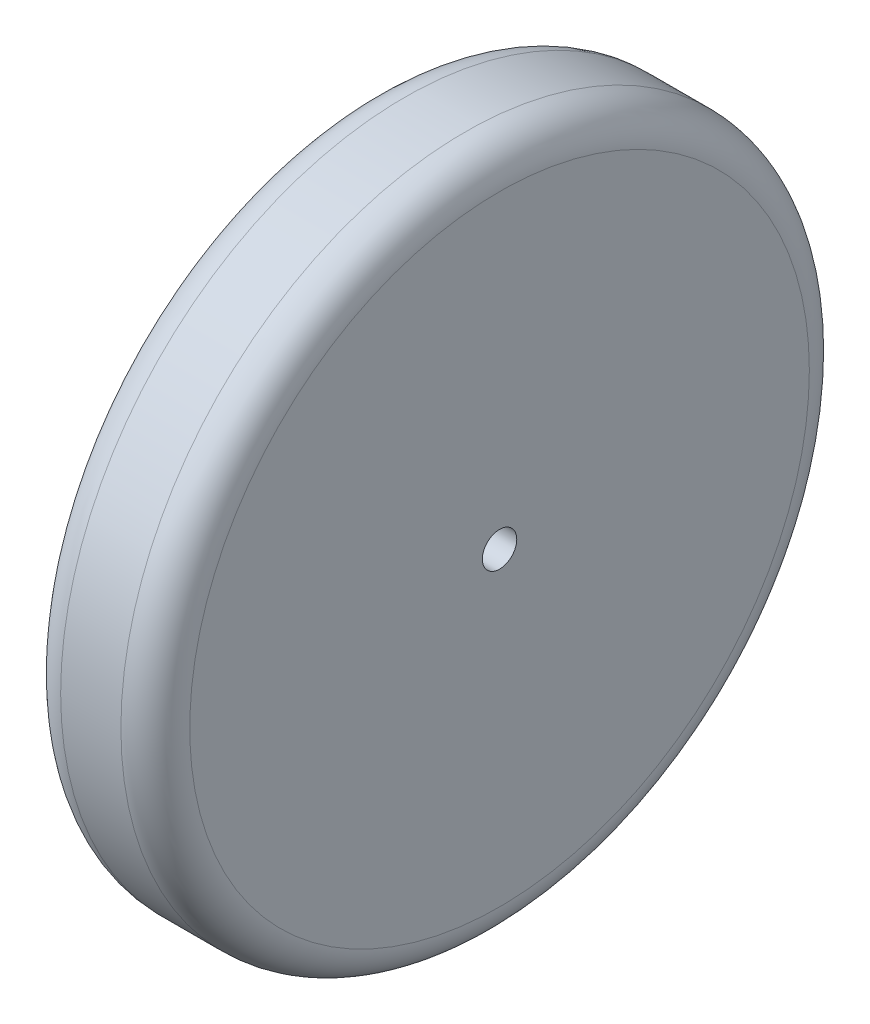
ISO-10303-21;
HEADER;
FILE_DESCRIPTION(('STEP AP214'),'2;1');
FILE_NAME('part.step','',(''),(''),'','','');
FILE_SCHEMA(('AUTOMOTIVE_DESIGN { 1 0 10303 214 1 1 1 1 }'));
ENDSEC;
DATA;
#1=APPLICATION_CONTEXT('core data for automotive mechanical design processes');
#2=APPLICATION_PROTOCOL_DEFINITION('international standard','automotive_design',2000,#1);
#3=PRODUCT_CONTEXT('',#1,'mechanical');
#4=PRODUCT('Part','Part','',(#3));
#5=PRODUCT_RELATED_PRODUCT_CATEGORY('part','',(#4));
#6=PRODUCT_DEFINITION_FORMATION('','',#4);
#7=PRODUCT_DEFINITION_CONTEXT('part definition',#1,'design');
#8=PRODUCT_DEFINITION('design','',#6,#7);
#9=PRODUCT_DEFINITION_SHAPE('','',#8);
#10=(LENGTH_UNIT() NAMED_UNIT(*) SI_UNIT(.MILLI.,.METRE.));
#11=(NAMED_UNIT(*) PLANE_ANGLE_UNIT() SI_UNIT($,.RADIAN.));
#12=(NAMED_UNIT(*) SI_UNIT($,.STERADIAN.) SOLID_ANGLE_UNIT());
#13=UNCERTAINTY_MEASURE_WITH_UNIT(LENGTH_MEASURE(1.E-05),#10,'distance_accuracy_value','');
#14=(GEOMETRIC_REPRESENTATION_CONTEXT(3) GLOBAL_UNCERTAINTY_ASSIGNED_CONTEXT((#13)) GLOBAL_UNIT_ASSIGNED_CONTEXT((#10,
#11,#12)) REPRESENTATION_CONTEXT('',''));
#15=CARTESIAN_POINT('',(0.,0.,0.));
#16=DIRECTION('',(0.,0.,1.));
#17=DIRECTION('',(1.,0.,0.));
#18=AXIS2_PLACEMENT_3D('',#15,#16,#17);
#19=CARTESIAN_POINT('',(37.5,0.,0.));
#20=DIRECTION('',(1.,0.,0.));
#21=DIRECTION('',(0.,0.,-1.));
#22=AXIS2_PLACEMENT_3D('',#19,#20,#21);
#23=PLANE('',#22);
#24=CARTESIAN_POINT('',(37.5,0.,0.));
#25=DIRECTION('',(1.,0.,0.));
#26=DIRECTION('',(0.,0.,-1.));
#27=AXIS2_PLACEMENT_3D('',#24,#25,#26);
#28=CIRCLE('',#27,180.);
#29=CARTESIAN_POINT('',(37.5,0.,-180.));
#30=VERTEX_POINT('',#29);
#31=EDGE_CURVE('E10',#30,#30,#28,.T.);
#32=ORIENTED_EDGE('',*,*,#31,.T.);
#33=EDGE_LOOP('',(#32));
#34=FACE_BOUND('',#33,.T.);
#35=CARTESIAN_POINT('',(37.5,0.,0.));
#36=DIRECTION('',(1.,0.,0.));
#37=DIRECTION('',(0.,0.,-1.));
#38=AXIS2_PLACEMENT_3D('',#35,#36,#37);
#39=CIRCLE('',#38,10.);
#40=CARTESIAN_POINT('',(37.5,0.,-10.));
#41=VERTEX_POINT('',#40);
#42=EDGE_CURVE('E67',#41,#41,#39,.T.);
#43=ORIENTED_EDGE('',*,*,#42,.F.);
#44=EDGE_LOOP('',(#43));
#45=FACE_BOUND('',#44,.T.);
#46=ADVANCED_FACE('F43',(#34,#45),#23,.T.);
#47=CARTESIAN_POINT('',(-37.5,0.,0.));
#48=DIRECTION('',(1.,0.,0.));
#49=DIRECTION('',(0.,0.,-1.));
#50=AXIS2_PLACEMENT_3D('',#47,#48,#49);
#51=PLANE('',#50);
#52=CARTESIAN_POINT('',(-37.5,0.,0.));
#53=DIRECTION('',(1.,0.,0.));
#54=DIRECTION('',(0.,0.,-1.));
#55=AXIS2_PLACEMENT_3D('',#52,#53,#54);
#56=CIRCLE('',#55,180.);
#57=CARTESIAN_POINT('',(-37.5,0.,-180.));
#58=VERTEX_POINT('',#57);
#59=EDGE_CURVE('E51',#58,#58,#56,.F.);
#60=ORIENTED_EDGE('',*,*,#59,.T.);
#61=EDGE_LOOP('',(#60));
#62=FACE_BOUND('',#61,.T.);
#63=CARTESIAN_POINT('',(-37.5,0.,0.));
#64=DIRECTION('',(1.,0.,0.));
#65=DIRECTION('',(0.,0.,-1.));
#66=AXIS2_PLACEMENT_3D('',#63,#64,#65);
#67=CIRCLE('',#66,10.);
#68=CARTESIAN_POINT('',(-37.5,0.,-10.));
#69=VERTEX_POINT('',#68);
#70=EDGE_CURVE('E68',#69,#69,#67,.T.);
#71=ORIENTED_EDGE('',*,*,#70,.T.);
#72=EDGE_LOOP('',(#71));
#73=FACE_BOUND('',#72,.T.);
#74=ADVANCED_FACE('F80',(#62,#73),#51,.F.);
#75=CARTESIAN_POINT('',(37.5,0.,0.));
#76=DIRECTION('',(-1.,0.,0.));
#77=DIRECTION('',(0.,0.,1.));
#78=AXIS2_PLACEMENT_3D('',#75,#76,#77);
#79=CYLINDRICAL_SURFACE('',#78,200.);
#80=CARTESIAN_POINT('',(-17.5,0.,0.));
#81=DIRECTION('',(1.,0.,0.));
#82=DIRECTION('',(0.,0.,-1.));
#83=AXIS2_PLACEMENT_3D('',#80,#81,#82);
#84=CIRCLE('',#83,200.);
#85=CARTESIAN_POINT('',(-17.5,0.,-200.));
#86=VERTEX_POINT('',#85);
#87=EDGE_CURVE('E56',#86,#86,#84,.T.);
#88=ORIENTED_EDGE('',*,*,#87,.T.);
#89=EDGE_LOOP('',(#88));
#90=FACE_BOUND('',#89,.T.);
#91=CARTESIAN_POINT('',(17.5,0.,0.));
#92=DIRECTION('',(1.,0.,0.));
#93=DIRECTION('',(0.,0.,-1.));
#94=AXIS2_PLACEMENT_3D('',#91,#92,#93);
#95=CIRCLE('',#94,200.);
#96=CARTESIAN_POINT('',(17.5,0.,-200.));
#97=VERTEX_POINT('',#96);
#98=EDGE_CURVE('E61',#97,#97,#95,.F.);
#99=ORIENTED_EDGE('',*,*,#98,.T.);
#100=EDGE_LOOP('',(#99));
#101=FACE_BOUND('',#100,.T.);
#102=ADVANCED_FACE('F86',(#90,#101),#79,.T.);
#103=CARTESIAN_POINT('',(37.5,0.,0.));
#104=DIRECTION('',(-1.,0.,0.));
#105=DIRECTION('',(0.,0.,1.));
#106=AXIS2_PLACEMENT_3D('',#103,#104,#105);
#107=CYLINDRICAL_SURFACE('',#106,10.);
#108=ORIENTED_EDGE('',*,*,#42,.T.);
#109=EDGE_LOOP('',(#108));
#110=FACE_BOUND('',#109,.T.);
#111=ORIENTED_EDGE('',*,*,#70,.F.);
#112=EDGE_LOOP('',(#111));
#113=FACE_BOUND('',#112,.T.);
#114=ADVANCED_FACE('F76',(#110,#113),#107,.F.);
#115=CARTESIAN_POINT('',(-17.5,0.,0.));
#116=DIRECTION('',(1.,0.,0.));
#117=DIRECTION('',(0.,0.,-1.));
#118=AXIS2_PLACEMENT_3D('',#115,#116,#117);
#119=TOROIDAL_SURFACE('',#118,180.,20.);
#120=ORIENTED_EDGE('',*,*,#59,.F.);
#121=EDGE_LOOP('',(#120));
#122=FACE_BOUND('',#121,.T.);
#123=ORIENTED_EDGE('',*,*,#87,.F.);
#124=EDGE_LOOP('',(#123));
#125=FACE_BOUND('',#124,.T.);
#126=ADVANCED_FACE('F92',(#122,#125),#119,.T.);
#127=CARTESIAN_POINT('',(17.5,0.,0.));
#128=DIRECTION('',(1.,0.,0.));
#129=DIRECTION('',(0.,0.,-1.));
#130=AXIS2_PLACEMENT_3D('',#127,#128,#129);
#131=TOROIDAL_SURFACE('',#130,180.,20.);
#132=ORIENTED_EDGE('',*,*,#98,.F.);
#133=EDGE_LOOP('',(#132));
#134=FACE_BOUND('',#133,.T.);
#135=ORIENTED_EDGE('',*,*,#31,.F.);
#136=EDGE_LOOP('',(#135));
#137=FACE_BOUND('',#136,.T.);
#138=ADVANCED_FACE('F45',(#134,#137),#131,.T.);
#139=CLOSED_SHELL('',(#46,#74,#102,#114,#126,#138));
#140=MANIFOLD_SOLID_BREP('B2',#139);
#141=ADVANCED_BREP_SHAPE_REPRESENTATION('',(#18,#140),#14);
#142=SHAPE_DEFINITION_REPRESENTATION(#9,#141);
ENDSEC;
END-ISO-10303-21;
